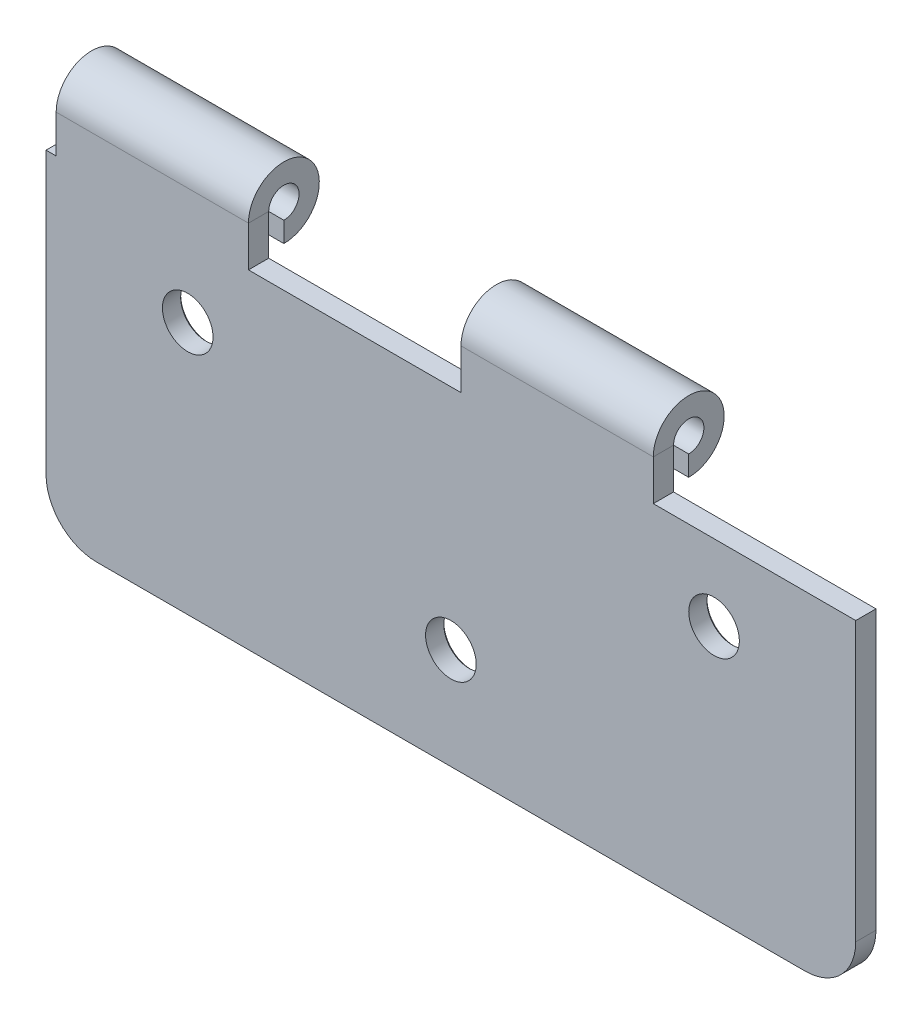
ISO-10303-21;
HEADER;
FILE_DESCRIPTION(('STEP AP214'),'2;1');
FILE_NAME('part.step','',(''),(''),'','','');
FILE_SCHEMA(('AUTOMOTIVE_DESIGN { 1 0 10303 214 1 1 1 1 }'));
ENDSEC;
DATA;
#1=APPLICATION_CONTEXT('core data for automotive mechanical design processes');
#2=APPLICATION_PROTOCOL_DEFINITION('international standard','automotive_design',2000,#1);
#3=PRODUCT_CONTEXT('',#1,'mechanical');
#4=PRODUCT('Part','Part','',(#3));
#5=PRODUCT_RELATED_PRODUCT_CATEGORY('part','',(#4));
#6=PRODUCT_DEFINITION_FORMATION('','',#4);
#7=PRODUCT_DEFINITION_CONTEXT('part definition',#1,'design');
#8=PRODUCT_DEFINITION('design','',#6,#7);
#9=PRODUCT_DEFINITION_SHAPE('','',#8);
#10=(LENGTH_UNIT() NAMED_UNIT(*) SI_UNIT(.MILLI.,.METRE.));
#11=(NAMED_UNIT(*) PLANE_ANGLE_UNIT() SI_UNIT($,.RADIAN.));
#12=(NAMED_UNIT(*) SI_UNIT($,.STERADIAN.) SOLID_ANGLE_UNIT());
#13=UNCERTAINTY_MEASURE_WITH_UNIT(LENGTH_MEASURE(1.E-05),#10,'distance_accuracy_value','');
#14=(GEOMETRIC_REPRESENTATION_CONTEXT(3) GLOBAL_UNCERTAINTY_ASSIGNED_CONTEXT((#13)) GLOBAL_UNIT_ASSIGNED_CONTEXT((#10,
#11,#12)) REPRESENTATION_CONTEXT('',''));
#15=CARTESIAN_POINT('',(0.,0.,0.));
#16=DIRECTION('',(0.,0.,1.));
#17=DIRECTION('',(1.,0.,0.));
#18=AXIS2_PLACEMENT_3D('',#15,#16,#17);
#19=CARTESIAN_POINT('',(0.,1.2490009027033E-13,-2.));
#20=DIRECTION('',(0.,0.,-1.));
#21=DIRECTION('',(-1.,0.,0.));
#22=AXIS2_PLACEMENT_3D('',#19,#20,#21);
#23=PLANE('',#22);
#24=CARTESIAN_POINT('',(0.,-9.99999999999976,-2.));
#25=DIRECTION('',(0.,0.,-1.));
#26=DIRECTION('',(-1.,0.,0.));
#27=AXIS2_PLACEMENT_3D('',#24,#25,#26);
#28=CIRCLE('',#27,2.69999999999998);
#29=CARTESIAN_POINT('',(-2.69999999999998,-9.99999999999976,-2.));
#30=VERTEX_POINT('',#29);
#31=EDGE_CURVE('E418',#30,#30,#28,.F.);
#32=ORIENTED_EDGE('',*,*,#31,.T.);
#33=EDGE_LOOP('',(#32));
#34=FACE_BOUND('',#33,.T.);
#35=CARTESIAN_POINT('',(-26.,5.00000000000006,-2.));
#36=DIRECTION('',(0.,0.,-1.));
#37=DIRECTION('',(-1.,0.,0.));
#38=AXIS2_PLACEMENT_3D('',#35,#36,#37);
#39=CIRCLE('',#38,2.69999999999998);
#40=CARTESIAN_POINT('',(-28.7,5.00000000000006,-2.));
#41=VERTEX_POINT('',#40);
#42=EDGE_CURVE('E414',#41,#41,#39,.F.);
#43=ORIENTED_EDGE('',*,*,#42,.T.);
#44=EDGE_LOOP('',(#43));
#45=FACE_BOUND('',#44,.T.);
#46=CARTESIAN_POINT('',(26.,5.00000000000006,-2.));
#47=DIRECTION('',(0.,0.,-1.));
#48=DIRECTION('',(-1.,0.,0.));
#49=AXIS2_PLACEMENT_3D('',#46,#47,#48);
#50=CIRCLE('',#49,2.69999999999998);
#51=CARTESIAN_POINT('',(23.3,5.00000000000006,-2.));
#52=VERTEX_POINT('',#51);
#53=EDGE_CURVE('E410',#52,#52,#50,.F.);
#54=ORIENTED_EDGE('',*,*,#53,.T.);
#55=EDGE_LOOP('',(#54));
#56=FACE_BOUND('',#55,.T.);
#57=DIRECTION('',(1.,0.,0.));
#58=VECTOR('',#57,1.);
#59=CARTESIAN_POINT('',(40.,-19.9999999999996,-2.));
#60=LINE('',#59,#58);
#61=CARTESIAN_POINT('',(-35.,-19.9999999999996,-2.));
#62=VERTEX_POINT('',#61);
#63=CARTESIAN_POINT('',(35.,-19.9999999999996,-2.));
#64=VERTEX_POINT('',#63);
#65=EDGE_CURVE('E361',#62,#64,#60,.T.);
#66=ORIENTED_EDGE('',*,*,#65,.F.);
#67=CARTESIAN_POINT('',(-35.,-14.9999999999998,-2.00000000000011));
#68=DIRECTION('',(0.,0.,-1.));
#69=DIRECTION('',(-1.,0.,0.));
#70=AXIS2_PLACEMENT_3D('',#67,#68,#69);
#71=CIRCLE('',#70,5.);
#72=CARTESIAN_POINT('',(-40.,-14.9999999999998,-2.00000000000011));
#73=VERTEX_POINT('',#72);
#74=EDGE_CURVE('E401',#62,#73,#71,.T.);
#75=ORIENTED_EDGE('',*,*,#74,.T.);
#76=DIRECTION('',(0.,-1.,0.));
#77=VECTOR('',#76,1.);
#78=CARTESIAN_POINT('',(-40.,20.0000000000004,-2.00000000000011));
#79=LINE('',#78,#77);
#80=CARTESIAN_POINT('',(-40.,12.7467078612051,-2.));
#81=VERTEX_POINT('',#80);
#82=EDGE_CURVE('E357',#81,#73,#79,.T.);
#83=ORIENTED_EDGE('',*,*,#82,.F.);
#84=DIRECTION('',(-1.,0.,0.));
#85=VECTOR('',#84,1.);
#86=CARTESIAN_POINT('',(-40.,12.7467078612051,-2.));
#87=LINE('',#86,#85);
#88=CARTESIAN_POINT('',(-39.,12.7467078612051,-2.));
#89=VERTEX_POINT('',#88);
#90=EDGE_CURVE('E245',#89,#81,#87,.T.);
#91=ORIENTED_EDGE('',*,*,#90,.F.);
#92=DIRECTION('',(0.,-1.,0.));
#93=VECTOR('',#92,1.);
#94=CARTESIAN_POINT('',(-39.,16.5,-2.00000000000011));
#95=LINE('',#94,#93);
#96=CARTESIAN_POINT('',(-39.,16.5,-2.00000000000011));
#97=VERTEX_POINT('',#96);
#98=EDGE_CURVE('E350',#97,#89,#95,.T.);
#99=ORIENTED_EDGE('',*,*,#98,.F.);
#100=DIRECTION('',(1.,0.,0.));
#101=VECTOR('',#100,1.);
#102=CARTESIAN_POINT('',(-20.,16.5,-2.00000000000011));
#103=LINE('',#102,#101);
#104=CARTESIAN_POINT('',(-20.,16.5,-2.00000000000011));
#105=VERTEX_POINT('',#104);
#106=EDGE_CURVE('E325',#105,#97,#103,.F.);
#107=ORIENTED_EDGE('',*,*,#106,.F.);
#108=DIRECTION('',(0.,1.,0.));
#109=VECTOR('',#108,1.);
#110=CARTESIAN_POINT('',(-20.,15.5,-2.00000000000011));
#111=LINE('',#110,#109);
#112=CARTESIAN_POINT('',(-20.,12.5000000000002,-2.));
#113=VERTEX_POINT('',#112);
#114=EDGE_CURVE('E346',#113,#105,#111,.T.);
#115=ORIENTED_EDGE('',*,*,#114,.F.);
#116=DIRECTION('',(-1.,0.,0.));
#117=VECTOR('',#116,1.);
#118=CARTESIAN_POINT('',(-19.,12.5000000000002,-2.));
#119=LINE('',#118,#117);
#120=CARTESIAN_POINT('',(1.00000000000001,12.5000000000002,-2.));
#121=VERTEX_POINT('',#120);
#122=EDGE_CURVE('E220',#121,#113,#119,.T.);
#123=ORIENTED_EDGE('',*,*,#122,.F.);
#124=DIRECTION('',(0.,-1.,0.));
#125=VECTOR('',#124,1.);
#126=CARTESIAN_POINT('',(1.00000000000001,16.5,-2.00000000000011));
#127=LINE('',#126,#125);
#128=CARTESIAN_POINT('',(1.00000000000001,16.5,-2.00000000000011));
#129=VERTEX_POINT('',#128);
#130=EDGE_CURVE('E298',#129,#121,#127,.T.);
#131=ORIENTED_EDGE('',*,*,#130,.F.);
#132=DIRECTION('',(1.,0.,0.));
#133=VECTOR('',#132,1.);
#134=CARTESIAN_POINT('',(20.,16.5,-2.00000000000011));
#135=LINE('',#134,#133);
#136=CARTESIAN_POINT('',(20.,16.5,-2.00000000000011));
#137=VERTEX_POINT('',#136);
#138=EDGE_CURVE('E274',#137,#129,#135,.F.);
#139=ORIENTED_EDGE('',*,*,#138,.F.);
#140=DIRECTION('',(0.,1.,0.));
#141=VECTOR('',#140,1.);
#142=CARTESIAN_POINT('',(20.,15.5,-2.00000000000011));
#143=LINE('',#142,#141);
#144=CARTESIAN_POINT('',(20.,12.5000000000002,-2.));
#145=VERTEX_POINT('',#144);
#146=EDGE_CURVE('E295',#145,#137,#143,.T.);
#147=ORIENTED_EDGE('',*,*,#146,.F.);
#148=DIRECTION('',(-1.,0.,0.));
#149=VECTOR('',#148,1.);
#150=CARTESIAN_POINT('',(21.,12.5000000000002,-2.));
#151=LINE('',#150,#149);
#152=CARTESIAN_POINT('',(40.,12.5000000000002,-2.));
#153=VERTEX_POINT('',#152);
#154=EDGE_CURVE('E205',#153,#145,#151,.T.);
#155=ORIENTED_EDGE('',*,*,#154,.F.);
#156=DIRECTION('',(0.,1.,0.));
#157=VECTOR('',#156,1.);
#158=CARTESIAN_POINT('',(40.,20.0000000000004,-2.00000000000011));
#159=LINE('',#158,#157);
#160=CARTESIAN_POINT('',(40.,-14.9999999999998,-2.00000000000011));
#161=VERTEX_POINT('',#160);
#162=EDGE_CURVE('E364',#161,#153,#159,.T.);
#163=ORIENTED_EDGE('',*,*,#162,.F.);
#164=CARTESIAN_POINT('',(35.,-14.9999999999998,-2.00000000000011));
#165=DIRECTION('',(0.,0.,-1.));
#166=DIRECTION('',(-1.,0.,0.));
#167=AXIS2_PLACEMENT_3D('',#164,#165,#166);
#168=CIRCLE('',#167,5.);
#169=EDGE_CURVE('E77',#161,#64,#168,.T.);
#170=ORIENTED_EDGE('',*,*,#169,.T.);
#171=EDGE_LOOP('',(#66,#75,#83,#91,#99,#107,#115,#123,#131,#139,#147,#155,#163,#170));
#172=FACE_BOUND('',#171,.T.);
#173=ADVANCED_FACE('F53',(#34,#45,#56,#172),#23,.T.);
#174=CARTESIAN_POINT('',(0.,0.,0.));
#175=DIRECTION('',(0.,0.,-1.));
#176=DIRECTION('',(-1.,0.,0.));
#177=AXIS2_PLACEMENT_3D('',#174,#175,#176);
#178=PLANE('',#177);
#179=CARTESIAN_POINT('',(26.,5.00000000000025,2.22044604925031E-13));
#180=DIRECTION('',(0.,0.,-1.));
#181=DIRECTION('',(-1.,0.,0.));
#182=AXIS2_PLACEMENT_3D('',#179,#180,#181);
#183=CIRCLE('',#182,2.49999999999999);
#184=CARTESIAN_POINT('',(23.5,5.00000000000025,2.22044604925031E-13));
#185=VERTEX_POINT('',#184);
#186=EDGE_CURVE('E742',#185,#185,#183,.T.);
#187=ORIENTED_EDGE('',*,*,#186,.T.);
#188=EDGE_LOOP('',(#187));
#189=FACE_BOUND('',#188,.T.);
#190=CARTESIAN_POINT('',(-26.,5.00000000000025,2.22044604925031E-13));
#191=DIRECTION('',(0.,0.,-1.));
#192=DIRECTION('',(-1.,0.,0.));
#193=AXIS2_PLACEMENT_3D('',#190,#191,#192);
#194=CIRCLE('',#193,2.49999999999999);
#195=CARTESIAN_POINT('',(-28.5,5.00000000000025,2.22044604925031E-13));
#196=VERTEX_POINT('',#195);
#197=EDGE_CURVE('E744',#196,#196,#194,.T.);
#198=ORIENTED_EDGE('',*,*,#197,.T.);
#199=EDGE_LOOP('',(#198));
#200=FACE_BOUND('',#199,.T.);
#201=CARTESIAN_POINT('',(0.,-9.99999999999998,2.22044604925031E-13));
#202=DIRECTION('',(0.,0.,-1.));
#203=DIRECTION('',(-1.,0.,0.));
#204=AXIS2_PLACEMENT_3D('',#201,#202,#203);
#205=CIRCLE('',#204,2.49999999999999);
#206=CARTESIAN_POINT('',(-2.49999999999999,-9.99999999999998,2.22044604925031E-13));
#207=VERTEX_POINT('',#206);
#208=EDGE_CURVE('E223',#207,#207,#205,.T.);
#209=ORIENTED_EDGE('',*,*,#208,.T.);
#210=EDGE_LOOP('',(#209));
#211=FACE_BOUND('',#210,.T.);
#212=DIRECTION('',(0.,-1.,0.));
#213=VECTOR('',#212,1.);
#214=CARTESIAN_POINT('',(-40.,20.0000000000002,2.22044604925031E-13));
#215=LINE('',#214,#213);
#216=CARTESIAN_POINT('',(-40.,12.7467078612049,2.22044604925031E-13));
#217=VERTEX_POINT('',#216);
#218=CARTESIAN_POINT('',(-40.,-15.,3.33066907387547E-13));
#219=VERTEX_POINT('',#218);
#220=EDGE_CURVE('E353',#217,#219,#215,.T.);
#221=ORIENTED_EDGE('',*,*,#220,.T.);
#222=CARTESIAN_POINT('',(-35.,-15.,3.33066907387547E-13));
#223=DIRECTION('',(0.,0.,-1.));
#224=DIRECTION('',(-1.,0.,0.));
#225=AXIS2_PLACEMENT_3D('',#222,#223,#224);
#226=CIRCLE('',#225,5.);
#227=CARTESIAN_POINT('',(-35.,-20.,2.22044604925031E-13));
#228=VERTEX_POINT('',#227);
#229=EDGE_CURVE('E389',#219,#228,#226,.F.);
#230=ORIENTED_EDGE('',*,*,#229,.T.);
#231=DIRECTION('',(1.,0.,0.));
#232=VECTOR('',#231,1.);
#233=CARTESIAN_POINT('',(40.,-20.,2.22044604925031E-13));
#234=LINE('',#233,#232);
#235=CARTESIAN_POINT('',(35.,-20.,2.22044604925031E-13));
#236=VERTEX_POINT('',#235);
#237=EDGE_CURVE('E370',#228,#236,#234,.T.);
#238=ORIENTED_EDGE('',*,*,#237,.T.);
#239=CARTESIAN_POINT('',(35.,-15.,3.33066907387547E-13));
#240=DIRECTION('',(0.,0.,-1.));
#241=DIRECTION('',(-1.,0.,0.));
#242=AXIS2_PLACEMENT_3D('',#239,#240,#241);
#243=CIRCLE('',#242,5.);
#244=CARTESIAN_POINT('',(40.,-15.,3.33066907387547E-13));
#245=VERTEX_POINT('',#244);
#246=EDGE_CURVE('E386',#236,#245,#243,.F.);
#247=ORIENTED_EDGE('',*,*,#246,.T.);
#248=DIRECTION('',(0.,1.,0.));
#249=VECTOR('',#248,1.);
#250=CARTESIAN_POINT('',(40.,20.0000000000002,2.22044604925031E-13));
#251=LINE('',#250,#249);
#252=CARTESIAN_POINT('',(40.,12.5,2.22044604925031E-13));
#253=VERTEX_POINT('',#252);
#254=EDGE_CURVE('E211',#245,#253,#251,.T.);
#255=ORIENTED_EDGE('',*,*,#254,.T.);
#256=DIRECTION('',(1.,0.,0.));
#257=VECTOR('',#256,1.);
#258=CARTESIAN_POINT('',(21.,12.5,2.22044604925031E-13));
#259=LINE('',#258,#257);
#260=CARTESIAN_POINT('',(20.,12.5,2.22044604925031E-13));
#261=VERTEX_POINT('',#260);
#262=EDGE_CURVE('E202',#261,#253,#259,.T.);
#263=ORIENTED_EDGE('',*,*,#262,.F.);
#264=DIRECTION('',(0.,-1.,0.));
#265=VECTOR('',#264,1.);
#266=CARTESIAN_POINT('',(20.,0.,0.));
#267=LINE('',#266,#265);
#268=CARTESIAN_POINT('',(20.,16.5000000000003,2.22044604925031E-13));
#269=VERTEX_POINT('',#268);
#270=EDGE_CURVE('E182',#269,#261,#267,.T.);
#271=ORIENTED_EDGE('',*,*,#270,.F.);
#272=DIRECTION('',(1.,0.,0.));
#273=VECTOR('',#272,1.);
#274=CARTESIAN_POINT('',(20.,16.5000000000003,2.22044604925031E-13));
#275=LINE('',#274,#273);
#276=CARTESIAN_POINT('',(1.00000000000003,16.5000000000003,2.22044604925031E-13));
#277=VERTEX_POINT('',#276);
#278=EDGE_CURVE('E255',#269,#277,#275,.F.);
#279=ORIENTED_EDGE('',*,*,#278,.T.);
#280=DIRECTION('',(0.,1.,0.));
#281=VECTOR('',#280,1.);
#282=CARTESIAN_POINT('',(1.00000000000001,0.,0.));
#283=LINE('',#282,#281);
#284=CARTESIAN_POINT('',(1.00000000000001,12.5,2.22044604925031E-13));
#285=VERTEX_POINT('',#284);
#286=EDGE_CURVE('E195',#285,#277,#283,.T.);
#287=ORIENTED_EDGE('',*,*,#286,.F.);
#288=DIRECTION('',(1.,0.,0.));
#289=VECTOR('',#288,1.);
#290=CARTESIAN_POINT('',(-19.,12.5,2.22044604925031E-13));
#291=LINE('',#290,#289);
#292=CARTESIAN_POINT('',(-20.,12.5,2.22044604925031E-13));
#293=VERTEX_POINT('',#292);
#294=EDGE_CURVE('E213',#293,#285,#291,.T.);
#295=ORIENTED_EDGE('',*,*,#294,.F.);
#296=DIRECTION('',(0.,-1.,0.));
#297=VECTOR('',#296,1.);
#298=CARTESIAN_POINT('',(-20.,0.,0.));
#299=LINE('',#298,#297);
#300=CARTESIAN_POINT('',(-20.,16.5000000000003,2.22044604925031E-13));
#301=VERTEX_POINT('',#300);
#302=EDGE_CURVE('E367',#301,#293,#299,.T.);
#303=ORIENTED_EDGE('',*,*,#302,.F.);
#304=DIRECTION('',(1.,0.,0.));
#305=VECTOR('',#304,1.);
#306=CARTESIAN_POINT('',(-20.,16.5000000000003,2.22044604925031E-13));
#307=LINE('',#306,#305);
#308=CARTESIAN_POINT('',(-39.,16.5000000000003,2.22044604925031E-13));
#309=VERTEX_POINT('',#308);
#310=EDGE_CURVE('E304',#301,#309,#307,.F.);
#311=ORIENTED_EDGE('',*,*,#310,.T.);
#312=DIRECTION('',(0.,1.,0.));
#313=VECTOR('',#312,1.);
#314=CARTESIAN_POINT('',(-39.,0.,0.));
#315=LINE('',#314,#313);
#316=CARTESIAN_POINT('',(-39.,12.7467078612049,2.22044604925031E-13));
#317=VERTEX_POINT('',#316);
#318=EDGE_CURVE('E196',#317,#309,#315,.T.);
#319=ORIENTED_EDGE('',*,*,#318,.F.);
#320=DIRECTION('',(1.,0.,0.));
#321=VECTOR('',#320,1.);
#322=CARTESIAN_POINT('',(-40.,12.7467078612049,2.22044604925031E-13));
#323=LINE('',#322,#321);
#324=EDGE_CURVE('E237',#217,#317,#323,.T.);
#325=ORIENTED_EDGE('',*,*,#324,.F.);
#326=EDGE_LOOP('',(#221,#230,#238,#247,#255,#263,#271,#279,#287,#295,#303,#311,#319,#325));
#327=FACE_BOUND('',#326,.T.);
#328=ADVANCED_FACE('F210',(#189,#200,#211,#327),#178,.F.);
#329=CARTESIAN_POINT('',(-40.,20.0000000000004,-2.00000000000011));
#330=DIRECTION('',(-1.,0.,0.));
#331=DIRECTION('',(0.,-1.,0.));
#332=AXIS2_PLACEMENT_3D('',#329,#330,#331);
#333=PLANE('',#332);
#334=ORIENTED_EDGE('',*,*,#82,.T.);
#335=DIRECTION('',(0.,0.,1.));
#336=VECTOR('',#335,1.);
#337=CARTESIAN_POINT('',(-40.,-14.9999999999998,-2.00000000000011));
#338=LINE('',#337,#336);
#339=EDGE_CURVE('E382',#73,#219,#338,.T.);
#340=ORIENTED_EDGE('',*,*,#339,.T.);
#341=ORIENTED_EDGE('',*,*,#220,.F.);
#342=DIRECTION('',(0.,0.,-1.));
#343=VECTOR('',#342,1.);
#344=CARTESIAN_POINT('',(-40.,12.7467078612046,0.000999999999806711));
#345=LINE('',#344,#343);
#346=EDGE_CURVE('E246',#217,#81,#345,.T.);
#347=ORIENTED_EDGE('',*,*,#346,.T.);
#348=EDGE_LOOP('',(#334,#340,#341,#347));
#349=FACE_BOUND('',#348,.T.);
#350=ADVANCED_FACE('F449',(#349),#333,.T.);
#351=CARTESIAN_POINT('',(40.,20.0000000000004,-2.00000000000011));
#352=DIRECTION('',(1.,0.,0.));
#353=DIRECTION('',(0.,0.,-1.));
#354=AXIS2_PLACEMENT_3D('',#351,#352,#353);
#355=PLANE('',#354);
#356=ORIENTED_EDGE('',*,*,#254,.F.);
#357=DIRECTION('',(0.,0.,1.));
#358=VECTOR('',#357,1.);
#359=CARTESIAN_POINT('',(40.,-14.9999999999998,-2.00000000000011));
#360=LINE('',#359,#358);
#361=EDGE_CURVE('E70',#245,#161,#360,.F.);
#362=ORIENTED_EDGE('',*,*,#361,.T.);
#363=ORIENTED_EDGE('',*,*,#162,.T.);
#364=DIRECTION('',(0.,0.,-1.));
#365=VECTOR('',#364,1.);
#366=CARTESIAN_POINT('',(40.,12.5000000000005,0.000999999999917733));
#367=LINE('',#366,#365);
#368=EDGE_CURVE('E207',#253,#153,#367,.T.);
#369=ORIENTED_EDGE('',*,*,#368,.F.);
#370=EDGE_LOOP('',(#356,#362,#363,#369));
#371=FACE_BOUND('',#370,.T.);
#372=ADVANCED_FACE('F457',(#371),#355,.T.);
#373=CARTESIAN_POINT('',(40.,-19.9999999999996,-2.));
#374=DIRECTION('',(0.,-1.,0.));
#375=DIRECTION('',(1.,0.,0.));
#376=AXIS2_PLACEMENT_3D('',#373,#374,#375);
#377=PLANE('',#376);
#378=ORIENTED_EDGE('',*,*,#237,.F.);
#379=DIRECTION('',(0.,0.,1.));
#380=VECTOR('',#379,1.);
#381=CARTESIAN_POINT('',(-35.,-19.9999999999996,-2.));
#382=LINE('',#381,#380);
#383=EDGE_CURVE('E396',#228,#62,#382,.F.);
#384=ORIENTED_EDGE('',*,*,#383,.T.);
#385=ORIENTED_EDGE('',*,*,#65,.T.);
#386=DIRECTION('',(0.,0.,1.));
#387=VECTOR('',#386,1.);
#388=CARTESIAN_POINT('',(35.,-19.9999999999996,-2.));
#389=LINE('',#388,#387);
#390=EDGE_CURVE('E392',#64,#236,#389,.T.);
#391=ORIENTED_EDGE('',*,*,#390,.T.);
#392=EDGE_LOOP('',(#378,#384,#385,#391));
#393=FACE_BOUND('',#392,.T.);
#394=ADVANCED_FACE('F460',(#393),#377,.T.);
#395=CARTESIAN_POINT('',(-39.,16.5,-2.00000000000011));
#396=DIRECTION('',(-1.,0.,0.));
#397=DIRECTION('',(0.,0.,1.));
#398=AXIS2_PLACEMENT_3D('',#395,#396,#397);
#399=PLANE('',#398);
#400=ORIENTED_EDGE('',*,*,#98,.T.);
#401=DIRECTION('',(0.,0.,-1.));
#402=VECTOR('',#401,1.);
#403=CARTESIAN_POINT('',(-39.,12.7467078612046,0.000999999999806711));
#404=LINE('',#403,#402);
#405=EDGE_CURVE('E241',#317,#89,#404,.T.);
#406=ORIENTED_EDGE('',*,*,#405,.F.);
#407=ORIENTED_EDGE('',*,*,#318,.T.);
#408=DIRECTION('',(0.,0.,1.));
#409=VECTOR('',#408,1.);
#410=CARTESIAN_POINT('',(-39.,16.5,-2.00000000000011));
#411=LINE('',#410,#409);
#412=EDGE_CURVE('E336',#97,#309,#411,.T.);
#413=ORIENTED_EDGE('',*,*,#412,.F.);
#414=EDGE_LOOP('',(#400,#406,#407,#413));
#415=FACE_BOUND('',#414,.T.);
#416=ADVANCED_FACE('F454',(#415),#399,.T.);
#417=CARTESIAN_POINT('',(-20.,15.5,-2.00000000000011));
#418=DIRECTION('',(1.,0.,0.));
#419=DIRECTION('',(0.,0.,-1.));
#420=AXIS2_PLACEMENT_3D('',#417,#418,#419);
#421=PLANE('',#420);
#422=DIRECTION('',(0.,0.,1.));
#423=VECTOR('',#422,1.);
#424=CARTESIAN_POINT('',(-20.,16.5,-2.00000000000011));
#425=LINE('',#424,#423);
#426=EDGE_CURVE('E313',#105,#301,#425,.T.);
#427=ORIENTED_EDGE('',*,*,#426,.T.);
#428=ORIENTED_EDGE('',*,*,#302,.T.);
#429=DIRECTION('',(0.,0.,-1.));
#430=VECTOR('',#429,1.);
#431=CARTESIAN_POINT('',(-20.,12.5000000000005,0.000999999999917733));
#432=LINE('',#431,#430);
#433=EDGE_CURVE('E229',#293,#113,#432,.T.);
#434=ORIENTED_EDGE('',*,*,#433,.T.);
#435=ORIENTED_EDGE('',*,*,#114,.T.);
#436=EDGE_LOOP('',(#427,#428,#434,#435));
#437=FACE_BOUND('',#436,.T.);
#438=ADVANCED_FACE('F518',(#437),#421,.T.);
#439=CARTESIAN_POINT('',(-29.5,15.0000000000001,-3.50000000000017));
#440=DIRECTION('',(0.,0.,-1.));
#441=DIRECTION('',(1.,0.,0.));
#442=AXIS2_PLACEMENT_3D('',#439,#440,#441);
#443=PLANE('',#442);
#444=DIRECTION('',(0.,-1.,0.));
#445=VECTOR('',#444,1.);
#446=CARTESIAN_POINT('',(-20.,15.0000000000001,-3.50000000000017));
#447=LINE('',#446,#445);
#448=CARTESIAN_POINT('',(-20.,15.0000000000001,-3.50000000000017));
#449=VERTEX_POINT('',#448);
#450=CARTESIAN_POINT('',(-20.,13.0000000000002,-3.50000000000006));
#451=VERTEX_POINT('',#450);
#452=EDGE_CURVE('E343',#449,#451,#447,.T.);
#453=ORIENTED_EDGE('',*,*,#452,.F.);
#454=DIRECTION('',(1.,0.,0.));
#455=VECTOR('',#454,1.);
#456=CARTESIAN_POINT('',(-20.,15.0000000000001,-3.50000000000017));
#457=LINE('',#456,#455);
#458=CARTESIAN_POINT('',(-39.,15.0000000000001,-3.50000000000017));
#459=VERTEX_POINT('',#458);
#460=EDGE_CURVE('E301',#459,#449,#457,.T.);
#461=ORIENTED_EDGE('',*,*,#460,.F.);
#462=DIRECTION('',(0.,-1.,0.));
#463=VECTOR('',#462,1.);
#464=CARTESIAN_POINT('',(-39.,15.0000000000001,-3.50000000000017));
#465=LINE('',#464,#463);
#466=CARTESIAN_POINT('',(-39.,13.0000000000002,-3.50000000000006));
#467=VERTEX_POINT('',#466);
#468=EDGE_CURVE('E340',#459,#467,#465,.T.);
#469=ORIENTED_EDGE('',*,*,#468,.T.);
#470=DIRECTION('',(1.,0.,0.));
#471=VECTOR('',#470,1.);
#472=CARTESIAN_POINT('',(-20.,13.0000000000002,-3.50000000000006));
#473=LINE('',#472,#471);
#474=EDGE_CURVE('E314',#467,#451,#473,.T.);
#475=ORIENTED_EDGE('',*,*,#474,.T.);
#476=EDGE_LOOP('',(#453,#461,#469,#475));
#477=FACE_BOUND('',#476,.T.);
#478=ADVANCED_FACE('F511',(#477),#443,.F.);
#479=CARTESIAN_POINT('',(-39.,16.5000000000005,-3.50000000000006));
#480=DIRECTION('',(-1.,0.,0.));
#481=DIRECTION('',(0.,0.,1.));
#482=AXIS2_PLACEMENT_3D('',#479,#480,#481);
#483=PLANE('',#482);
#484=ORIENTED_EDGE('',*,*,#468,.F.);
#485=CARTESIAN_POINT('',(-39.,16.5000000000005,-3.50000000000006));
#486=DIRECTION('',(1.,0.,0.));
#487=DIRECTION('',(0.,0.,-1.));
#488=AXIS2_PLACEMENT_3D('',#485,#486,#487);
#489=CIRCLE('',#488,1.5);
#490=EDGE_CURVE('E318',#97,#459,#489,.F.);
#491=ORIENTED_EDGE('',*,*,#490,.F.);
#492=ORIENTED_EDGE('',*,*,#412,.T.);
#493=CARTESIAN_POINT('',(-39.,16.5000000000005,-3.50000000000006));
#494=DIRECTION('',(1.,0.,0.));
#495=DIRECTION('',(0.,0.,-1.));
#496=AXIS2_PLACEMENT_3D('',#493,#494,#495);
#497=CIRCLE('',#496,3.5);
#498=EDGE_CURVE('E308',#309,#467,#497,.F.);
#499=ORIENTED_EDGE('',*,*,#498,.T.);
#500=EDGE_LOOP('',(#484,#491,#492,#499));
#501=FACE_BOUND('',#500,.T.);
#502=ADVANCED_FACE('F507',(#501),#483,.T.);
#503=CARTESIAN_POINT('',(-20.,16.5000000000005,-3.50000000000006));
#504=DIRECTION('',(-1.,0.,0.));
#505=DIRECTION('',(0.,0.,1.));
#506=AXIS2_PLACEMENT_3D('',#503,#504,#505);
#507=PLANE('',#506);
#508=CARTESIAN_POINT('',(-20.,16.5000000000005,-3.50000000000006));
#509=DIRECTION('',(1.,0.,0.));
#510=DIRECTION('',(0.,0.,-1.));
#511=AXIS2_PLACEMENT_3D('',#508,#509,#510);
#512=CIRCLE('',#511,1.5);
#513=EDGE_CURVE('E329',#449,#105,#512,.T.);
#514=ORIENTED_EDGE('',*,*,#513,.F.);
#515=ORIENTED_EDGE('',*,*,#452,.T.);
#516=CARTESIAN_POINT('',(-20.,16.5000000000005,-3.50000000000006));
#517=DIRECTION('',(1.,0.,0.));
#518=DIRECTION('',(0.,0.,-1.));
#519=AXIS2_PLACEMENT_3D('',#516,#517,#518);
#520=CIRCLE('',#519,3.5);
#521=EDGE_CURVE('E309',#451,#301,#520,.T.);
#522=ORIENTED_EDGE('',*,*,#521,.T.);
#523=ORIENTED_EDGE('',*,*,#426,.F.);
#524=EDGE_LOOP('',(#514,#515,#522,#523));
#525=FACE_BOUND('',#524,.T.);
#526=ADVANCED_FACE('F514',(#525),#507,.F.);
#527=CARTESIAN_POINT('',(-20.,16.5000000000005,-3.50000000000006));
#528=DIRECTION('',(1.,0.,0.));
#529=DIRECTION('',(0.,-1.,0.));
#530=AXIS2_PLACEMENT_3D('',#527,#528,#529);
#531=CYLINDRICAL_SURFACE('',#530,3.5);
#532=ORIENTED_EDGE('',*,*,#310,.F.);
#533=ORIENTED_EDGE('',*,*,#521,.F.);
#534=ORIENTED_EDGE('',*,*,#474,.F.);
#535=ORIENTED_EDGE('',*,*,#498,.F.);
#536=EDGE_LOOP('',(#532,#533,#534,#535));
#537=FACE_BOUND('',#536,.T.);
#538=ADVANCED_FACE('F521',(#537),#531,.T.);
#539=CARTESIAN_POINT('',(-20.,16.5000000000005,-3.50000000000006));
#540=DIRECTION('',(1.,0.,0.));
#541=DIRECTION('',(0.,-1.,0.));
#542=AXIS2_PLACEMENT_3D('',#539,#540,#541);
#543=CYLINDRICAL_SURFACE('',#542,1.5);
#544=ORIENTED_EDGE('',*,*,#106,.T.);
#545=ORIENTED_EDGE('',*,*,#490,.T.);
#546=ORIENTED_EDGE('',*,*,#460,.T.);
#547=ORIENTED_EDGE('',*,*,#513,.T.);
#548=EDGE_LOOP('',(#544,#545,#546,#547));
#549=FACE_BOUND('',#548,.T.);
#550=ADVANCED_FACE('F505',(#549),#543,.F.);
#551=CARTESIAN_POINT('',(1.00000000000001,16.5,-2.00000000000011));
#552=DIRECTION('',(-1.,0.,0.));
#553=DIRECTION('',(0.,0.,1.));
#554=AXIS2_PLACEMENT_3D('',#551,#552,#553);
#555=PLANE('',#554);
#556=ORIENTED_EDGE('',*,*,#130,.T.);
#557=DIRECTION('',(0.,0.,-1.));
#558=VECTOR('',#557,1.);
#559=CARTESIAN_POINT('',(1.00000000000001,12.5000000000005,0.000999999999917733));
#560=LINE('',#559,#558);
#561=EDGE_CURVE('E233',#285,#121,#560,.T.);
#562=ORIENTED_EDGE('',*,*,#561,.F.);
#563=ORIENTED_EDGE('',*,*,#286,.T.);
#564=DIRECTION('',(0.,0.,1.));
#565=VECTOR('',#564,1.);
#566=CARTESIAN_POINT('',(1.00000000000001,16.5,-2.00000000000011));
#567=LINE('',#566,#565);
#568=EDGE_CURVE('E285',#129,#277,#567,.T.);
#569=ORIENTED_EDGE('',*,*,#568,.F.);
#570=EDGE_LOOP('',(#556,#562,#563,#569));
#571=FACE_BOUND('',#570,.T.);
#572=ADVANCED_FACE('F529',(#571),#555,.T.);
#573=CARTESIAN_POINT('',(20.,15.5,-2.00000000000011));
#574=DIRECTION('',(1.,0.,0.));
#575=DIRECTION('',(0.,0.,-1.));
#576=AXIS2_PLACEMENT_3D('',#573,#574,#575);
#577=PLANE('',#576);
#578=DIRECTION('',(0.,0.,1.));
#579=VECTOR('',#578,1.);
#580=CARTESIAN_POINT('',(20.,16.5,-2.00000000000011));
#581=LINE('',#580,#579);
#582=EDGE_CURVE('E189',#137,#269,#581,.T.);
#583=ORIENTED_EDGE('',*,*,#582,.T.);
#584=ORIENTED_EDGE('',*,*,#270,.T.);
#585=DIRECTION('',(0.,0.,-1.));
#586=VECTOR('',#585,1.);
#587=CARTESIAN_POINT('',(20.,12.5000000000005,0.000999999999917733));
#588=LINE('',#587,#586);
#589=EDGE_CURVE('E186',#261,#145,#588,.T.);
#590=ORIENTED_EDGE('',*,*,#589,.T.);
#591=ORIENTED_EDGE('',*,*,#146,.T.);
#592=EDGE_LOOP('',(#583,#584,#590,#591));
#593=FACE_BOUND('',#592,.T.);
#594=ADVANCED_FACE('F184',(#593),#577,.T.);
#595=CARTESIAN_POINT('',(10.5,15.0000000000001,-3.50000000000017));
#596=DIRECTION('',(0.,0.,-1.));
#597=DIRECTION('',(1.,0.,0.));
#598=AXIS2_PLACEMENT_3D('',#595,#596,#597);
#599=PLANE('',#598);
#600=DIRECTION('',(0.,-1.,0.));
#601=VECTOR('',#600,1.);
#602=CARTESIAN_POINT('',(20.,15.0000000000001,-3.50000000000017));
#603=LINE('',#602,#601);
#604=CARTESIAN_POINT('',(20.,15.0000000000001,-3.50000000000017));
#605=VERTEX_POINT('',#604);
#606=CARTESIAN_POINT('',(20.,13.0000000000002,-3.50000000000006));
#607=VERTEX_POINT('',#606);
#608=EDGE_CURVE('E292',#605,#607,#603,.T.);
#609=ORIENTED_EDGE('',*,*,#608,.F.);
#610=DIRECTION('',(1.,0.,0.));
#611=VECTOR('',#610,1.);
#612=CARTESIAN_POINT('',(20.,15.0000000000001,-3.50000000000017));
#613=LINE('',#612,#611);
#614=CARTESIAN_POINT('',(1.00000000000001,15.0000000000001,-3.50000000000017));
#615=VERTEX_POINT('',#614);
#616=EDGE_CURVE('E227',#615,#605,#613,.T.);
#617=ORIENTED_EDGE('',*,*,#616,.F.);
#618=DIRECTION('',(0.,-1.,0.));
#619=VECTOR('',#618,1.);
#620=CARTESIAN_POINT('',(1.00000000000001,15.0000000000001,-3.50000000000017));
#621=LINE('',#620,#619);
#622=CARTESIAN_POINT('',(1.00000000000003,13.0000000000002,-3.50000000000006));
#623=VERTEX_POINT('',#622);
#624=EDGE_CURVE('E289',#615,#623,#621,.T.);
#625=ORIENTED_EDGE('',*,*,#624,.T.);
#626=DIRECTION('',(1.,0.,0.));
#627=VECTOR('',#626,1.);
#628=CARTESIAN_POINT('',(20.,13.0000000000002,-3.50000000000006));
#629=LINE('',#628,#627);
#630=EDGE_CURVE('E263',#623,#607,#629,.T.);
#631=ORIENTED_EDGE('',*,*,#630,.T.);
#632=EDGE_LOOP('',(#609,#617,#625,#631));
#633=FACE_BOUND('',#632,.T.);
#634=ADVANCED_FACE('F540',(#633),#599,.F.);
#635=CARTESIAN_POINT('',(1.00000000000001,16.5000000000005,-3.50000000000006));
#636=DIRECTION('',(-1.,0.,0.));
#637=DIRECTION('',(0.,0.,1.));
#638=AXIS2_PLACEMENT_3D('',#635,#636,#637);
#639=PLANE('',#638);
#640=ORIENTED_EDGE('',*,*,#624,.F.);
#641=CARTESIAN_POINT('',(1.00000000000001,16.5000000000005,-3.50000000000006));
#642=DIRECTION('',(1.,0.,0.));
#643=DIRECTION('',(0.,0.,-1.));
#644=AXIS2_PLACEMENT_3D('',#641,#642,#643);
#645=CIRCLE('',#644,1.49999999999999);
#646=EDGE_CURVE('E267',#129,#615,#645,.F.);
#647=ORIENTED_EDGE('',*,*,#646,.F.);
#648=ORIENTED_EDGE('',*,*,#568,.T.);
#649=CARTESIAN_POINT('',(1.00000000000003,16.5000000000005,-3.50000000000006));
#650=DIRECTION('',(1.,0.,0.));
#651=DIRECTION('',(0.,0.,-1.));
#652=AXIS2_PLACEMENT_3D('',#649,#650,#651);
#653=CIRCLE('',#652,3.49999999999999);
#654=EDGE_CURVE('E258',#277,#623,#653,.F.);
#655=ORIENTED_EDGE('',*,*,#654,.T.);
#656=EDGE_LOOP('',(#640,#647,#648,#655));
#657=FACE_BOUND('',#656,.T.);
#658=ADVANCED_FACE('F536',(#657),#639,.T.);
#659=CARTESIAN_POINT('',(20.,16.5000000000005,-3.50000000000006));
#660=DIRECTION('',(-1.,0.,0.));
#661=DIRECTION('',(0.,0.,1.));
#662=AXIS2_PLACEMENT_3D('',#659,#660,#661);
#663=PLANE('',#662);
#664=CARTESIAN_POINT('',(20.,16.5000000000005,-3.50000000000006));
#665=DIRECTION('',(1.,0.,0.));
#666=DIRECTION('',(0.,0.,-1.));
#667=AXIS2_PLACEMENT_3D('',#664,#665,#666);
#668=CIRCLE('',#667,1.49999999999999);
#669=EDGE_CURVE('E278',#605,#137,#668,.T.);
#670=ORIENTED_EDGE('',*,*,#669,.F.);
#671=ORIENTED_EDGE('',*,*,#608,.T.);
#672=CARTESIAN_POINT('',(20.,16.5000000000005,-3.50000000000006));
#673=DIRECTION('',(1.,0.,0.));
#674=DIRECTION('',(0.,0.,-1.));
#675=AXIS2_PLACEMENT_3D('',#672,#673,#674);
#676=CIRCLE('',#675,3.49999999999999);
#677=EDGE_CURVE('E259',#607,#269,#676,.T.);
#678=ORIENTED_EDGE('',*,*,#677,.T.);
#679=ORIENTED_EDGE('',*,*,#582,.F.);
#680=EDGE_LOOP('',(#670,#671,#678,#679));
#681=FACE_BOUND('',#680,.T.);
#682=ADVANCED_FACE('F542',(#681),#663,.F.);
#683=CARTESIAN_POINT('',(20.,16.5000000000005,-3.50000000000006));
#684=DIRECTION('',(1.,0.,0.));
#685=DIRECTION('',(0.,-1.,0.));
#686=AXIS2_PLACEMENT_3D('',#683,#684,#685);
#687=CYLINDRICAL_SURFACE('',#686,3.49999999999999);
#688=ORIENTED_EDGE('',*,*,#278,.F.);
#689=ORIENTED_EDGE('',*,*,#677,.F.);
#690=ORIENTED_EDGE('',*,*,#630,.F.);
#691=ORIENTED_EDGE('',*,*,#654,.F.);
#692=EDGE_LOOP('',(#688,#689,#690,#691));
#693=FACE_BOUND('',#692,.T.);
#694=ADVANCED_FACE('F545',(#693),#687,.T.);
#695=CARTESIAN_POINT('',(20.,16.5000000000005,-3.50000000000006));
#696=DIRECTION('',(1.,0.,0.));
#697=DIRECTION('',(0.,-1.,0.));
#698=AXIS2_PLACEMENT_3D('',#695,#696,#697);
#699=CYLINDRICAL_SURFACE('',#698,1.49999999999999);
#700=ORIENTED_EDGE('',*,*,#138,.T.);
#701=ORIENTED_EDGE('',*,*,#646,.T.);
#702=ORIENTED_EDGE('',*,*,#616,.T.);
#703=ORIENTED_EDGE('',*,*,#669,.T.);
#704=EDGE_LOOP('',(#700,#701,#702,#703));
#705=FACE_BOUND('',#704,.T.);
#706=ADVANCED_FACE('F534',(#705),#699,.F.);
#707=CARTESIAN_POINT('',(21.,12.5000000000005,0.000999999999917733));
#708=DIRECTION('',(0.,-1.,0.));
#709=DIRECTION('',(1.,0.,0.));
#710=AXIS2_PLACEMENT_3D('',#707,#708,#709);
#711=PLANE('',#710);
#712=ORIENTED_EDGE('',*,*,#262,.T.);
#713=ORIENTED_EDGE('',*,*,#368,.T.);
#714=ORIENTED_EDGE('',*,*,#154,.T.);
#715=ORIENTED_EDGE('',*,*,#589,.F.);
#716=EDGE_LOOP('',(#712,#713,#714,#715));
#717=FACE_BOUND('',#716,.T.);
#718=ADVANCED_FACE('F200',(#717),#711,.F.);
#719=CARTESIAN_POINT('',(-19.,12.5000000000005,0.000999999999917733));
#720=DIRECTION('',(0.,-1.,0.));
#721=DIRECTION('',(1.,0.,0.));
#722=AXIS2_PLACEMENT_3D('',#719,#720,#721);
#723=PLANE('',#722);
#724=ORIENTED_EDGE('',*,*,#294,.T.);
#725=ORIENTED_EDGE('',*,*,#561,.T.);
#726=ORIENTED_EDGE('',*,*,#122,.T.);
#727=ORIENTED_EDGE('',*,*,#433,.F.);
#728=EDGE_LOOP('',(#724,#725,#726,#727));
#729=FACE_BOUND('',#728,.T.);
#730=ADVANCED_FACE('F525',(#729),#723,.F.);
#731=CARTESIAN_POINT('',(-40.,12.7467078612046,0.000999999999806711));
#732=DIRECTION('',(0.,-1.,0.));
#733=DIRECTION('',(0.,0.,-1.));
#734=AXIS2_PLACEMENT_3D('',#731,#732,#733);
#735=PLANE('',#734);
#736=ORIENTED_EDGE('',*,*,#324,.T.);
#737=ORIENTED_EDGE('',*,*,#405,.T.);
#738=ORIENTED_EDGE('',*,*,#90,.T.);
#739=ORIENTED_EDGE('',*,*,#346,.F.);
#740=EDGE_LOOP('',(#736,#737,#738,#739));
#741=FACE_BOUND('',#740,.T.);
#742=ADVANCED_FACE('F471',(#741),#735,.F.);
#743=CARTESIAN_POINT('',(-35.,-14.9999999999998,-2.00000000000011));
#744=DIRECTION('',(0.,0.,1.));
#745=DIRECTION('',(1.,0.,0.));
#746=AXIS2_PLACEMENT_3D('',#743,#744,#745);
#747=CYLINDRICAL_SURFACE('',#746,5.);
#748=ORIENTED_EDGE('',*,*,#74,.F.);
#749=ORIENTED_EDGE('',*,*,#383,.F.);
#750=ORIENTED_EDGE('',*,*,#229,.F.);
#751=ORIENTED_EDGE('',*,*,#339,.F.);
#752=EDGE_LOOP('',(#748,#749,#750,#751));
#753=FACE_BOUND('',#752,.T.);
#754=ADVANCED_FACE('F467',(#753),#747,.T.);
#755=CARTESIAN_POINT('',(35.,-14.9999999999998,-2.00000000000011));
#756=DIRECTION('',(0.,0.,1.));
#757=DIRECTION('',(1.,0.,0.));
#758=AXIS2_PLACEMENT_3D('',#755,#756,#757);
#759=CYLINDRICAL_SURFACE('',#758,5.);
#760=ORIENTED_EDGE('',*,*,#169,.F.);
#761=ORIENTED_EDGE('',*,*,#361,.F.);
#762=ORIENTED_EDGE('',*,*,#246,.F.);
#763=ORIENTED_EDGE('',*,*,#390,.F.);
#764=EDGE_LOOP('',(#760,#761,#762,#763));
#765=FACE_BOUND('',#764,.T.);
#766=ADVANCED_FACE('F470',(#765),#759,.T.);
#767=CARTESIAN_POINT('',(0.,-9.99999999999976,-2.));
#768=DIRECTION('',(0.,0.,-1.));
#769=DIRECTION('',(-1.,0.,0.));
#770=AXIS2_PLACEMENT_3D('',#767,#768,#769);
#771=CYLINDRICAL_SURFACE('',#770,2.49999999999999);
#772=CARTESIAN_POINT('',(0.,-9.99999999999999,-1.80000000000002));
#773=DIRECTION('',(0.,0.,-1.));
#774=DIRECTION('',(-1.,0.,0.));
#775=AXIS2_PLACEMENT_3D('',#772,#773,#774);
#776=CIRCLE('',#775,2.49999999999999);
#777=CARTESIAN_POINT('',(-2.49999999999999,-9.99999999999999,-1.80000000000002));
#778=VERTEX_POINT('',#777);
#779=EDGE_CURVE('E406',#778,#778,#776,.T.);
#780=ORIENTED_EDGE('',*,*,#779,.T.);
#781=EDGE_LOOP('',(#780));
#782=FACE_BOUND('',#781,.T.);
#783=ORIENTED_EDGE('',*,*,#208,.F.);
#784=EDGE_LOOP('',(#783));
#785=FACE_BOUND('',#784,.T.);
#786=ADVANCED_FACE('F474',(#782,#785),#771,.F.);
#787=CARTESIAN_POINT('',(-26.,5.00000000000006,-2.));
#788=DIRECTION('',(0.,0.,-1.));
#789=DIRECTION('',(-1.,0.,0.));
#790=AXIS2_PLACEMENT_3D('',#787,#788,#789);
#791=CYLINDRICAL_SURFACE('',#790,2.49999999999999);
#792=CARTESIAN_POINT('',(-26.,5.00000000000037,-1.80000000000002));
#793=DIRECTION('',(0.,0.,-1.));
#794=DIRECTION('',(-1.,0.,0.));
#795=AXIS2_PLACEMENT_3D('',#792,#793,#794);
#796=CIRCLE('',#795,2.49999999999999);
#797=CARTESIAN_POINT('',(-28.5,5.00000000000037,-1.80000000000002));
#798=VERTEX_POINT('',#797);
#799=EDGE_CURVE('E63',#798,#798,#796,.T.);
#800=ORIENTED_EDGE('',*,*,#799,.T.);
#801=EDGE_LOOP('',(#800));
#802=FACE_BOUND('',#801,.T.);
#803=ORIENTED_EDGE('',*,*,#197,.F.);
#804=EDGE_LOOP('',(#803));
#805=FACE_BOUND('',#804,.T.);
#806=ADVANCED_FACE('F426',(#802,#805),#791,.F.);
#807=CARTESIAN_POINT('',(26.,5.00000000000006,-2.));
#808=DIRECTION('',(0.,0.,-1.));
#809=DIRECTION('',(-1.,0.,0.));
#810=AXIS2_PLACEMENT_3D('',#807,#808,#809);
#811=CYLINDRICAL_SURFACE('',#810,2.49999999999999);
#812=CARTESIAN_POINT('',(26.,5.00000000000037,-1.80000000000002));
#813=DIRECTION('',(0.,0.,-1.));
#814=DIRECTION('',(-1.,0.,0.));
#815=AXIS2_PLACEMENT_3D('',#812,#813,#814);
#816=CIRCLE('',#815,2.49999999999999);
#817=CARTESIAN_POINT('',(23.5,5.00000000000037,-1.80000000000002));
#818=VERTEX_POINT('',#817);
#819=EDGE_CURVE('E11',#818,#818,#816,.T.);
#820=ORIENTED_EDGE('',*,*,#819,.T.);
#821=EDGE_LOOP('',(#820));
#822=FACE_BOUND('',#821,.T.);
#823=ORIENTED_EDGE('',*,*,#186,.F.);
#824=EDGE_LOOP('',(#823));
#825=FACE_BOUND('',#824,.T.);
#826=ADVANCED_FACE('F438',(#822,#825),#811,.F.);
#827=CARTESIAN_POINT('',(0.,-9.99999999999999,-1.80000000000002));
#828=DIRECTION('',(0.,0.,-1.));
#829=DIRECTION('',(-1.,0.,0.));
#830=AXIS2_PLACEMENT_3D('',#827,#828,#829);
#831=CONICAL_SURFACE('',#830,2.49999999999999,0.785398163397449);
#832=ORIENTED_EDGE('',*,*,#31,.F.);
#833=EDGE_LOOP('',(#832));
#834=FACE_BOUND('',#833,.T.);
#835=ORIENTED_EDGE('',*,*,#779,.F.);
#836=EDGE_LOOP('',(#835));
#837=FACE_BOUND('',#836,.T.);
#838=ADVANCED_FACE('F431',(#834,#837),#831,.F.);
#839=CARTESIAN_POINT('',(-26.,5.00000000000037,-1.80000000000002));
#840=DIRECTION('',(0.,0.,-1.));
#841=DIRECTION('',(-1.,0.,0.));
#842=AXIS2_PLACEMENT_3D('',#839,#840,#841);
#843=CONICAL_SURFACE('',#842,2.49999999999999,0.78539816339745);
#844=ORIENTED_EDGE('',*,*,#42,.F.);
#845=EDGE_LOOP('',(#844));
#846=FACE_BOUND('',#845,.T.);
#847=ORIENTED_EDGE('',*,*,#799,.F.);
#848=EDGE_LOOP('',(#847));
#849=FACE_BOUND('',#848,.T.);
#850=ADVANCED_FACE('F429',(#846,#849),#843,.F.);
#851=CARTESIAN_POINT('',(26.,5.00000000000037,-1.80000000000002));
#852=DIRECTION('',(0.,0.,-1.));
#853=DIRECTION('',(-1.,0.,0.));
#854=AXIS2_PLACEMENT_3D('',#851,#852,#853);
#855=CONICAL_SURFACE('',#854,2.49999999999999,0.78539816339745);
#856=ORIENTED_EDGE('',*,*,#53,.F.);
#857=EDGE_LOOP('',(#856));
#858=FACE_BOUND('',#857,.T.);
#859=ORIENTED_EDGE('',*,*,#819,.F.);
#860=EDGE_LOOP('',(#859));
#861=FACE_BOUND('',#860,.T.);
#862=ADVANCED_FACE('F56',(#858,#861),#855,.F.);
#863=CLOSED_SHELL('',(#173,#328,#350,#372,#394,#416,#438,#478,#502,#526,#538,#550,#572,#594,
#634,#658,#682,#694,#706,#718,#730,#742,#754,#766,#786,#806,#826,#838,#850,#862));
#864=MANIFOLD_SOLID_BREP('B2',#863);
#865=ADVANCED_BREP_SHAPE_REPRESENTATION('',(#18,#864),#14);
#866=SHAPE_DEFINITION_REPRESENTATION(#9,#865);
ENDSEC;
END-ISO-10303-21;
